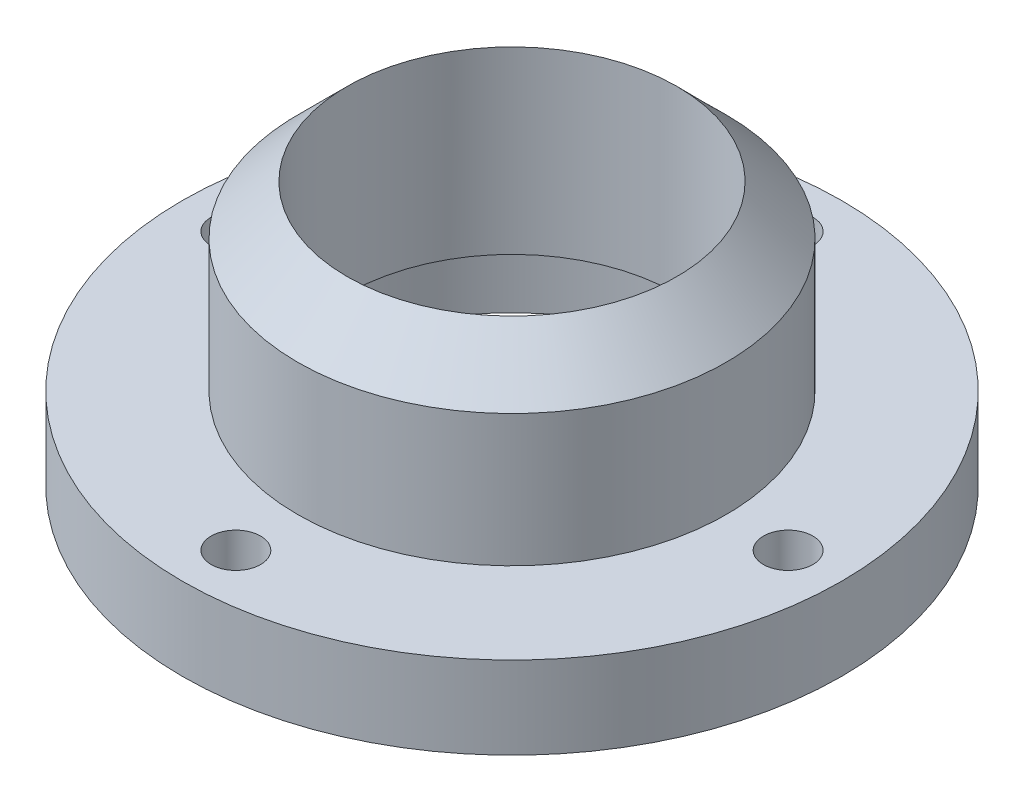
ISO-10303-21;
HEADER;
FILE_DESCRIPTION(('STEP AP214'),'2;1');
FILE_NAME('part.step','',(''),(''),'','','');
FILE_SCHEMA(('AUTOMOTIVE_DESIGN { 1 0 10303 214 1 1 1 1 }'));
ENDSEC;
DATA;
#1=APPLICATION_CONTEXT('core data for automotive mechanical design processes');
#2=APPLICATION_PROTOCOL_DEFINITION('international standard','automotive_design',2000,#1);
#3=PRODUCT_CONTEXT('',#1,'mechanical');
#4=PRODUCT('Part','Part','',(#3));
#5=PRODUCT_RELATED_PRODUCT_CATEGORY('part','',(#4));
#6=PRODUCT_DEFINITION_FORMATION('','',#4);
#7=PRODUCT_DEFINITION_CONTEXT('part definition',#1,'design');
#8=PRODUCT_DEFINITION('design','',#6,#7);
#9=PRODUCT_DEFINITION_SHAPE('','',#8);
#10=(LENGTH_UNIT() NAMED_UNIT(*) SI_UNIT(.MILLI.,.METRE.));
#11=(NAMED_UNIT(*) PLANE_ANGLE_UNIT() SI_UNIT($,.RADIAN.));
#12=(NAMED_UNIT(*) SI_UNIT($,.STERADIAN.) SOLID_ANGLE_UNIT());
#13=UNCERTAINTY_MEASURE_WITH_UNIT(LENGTH_MEASURE(1.E-05),#10,'distance_accuracy_value','');
#14=(GEOMETRIC_REPRESENTATION_CONTEXT(3) GLOBAL_UNCERTAINTY_ASSIGNED_CONTEXT((#13)) GLOBAL_UNIT_ASSIGNED_CONTEXT((#10,
#11,#12)) REPRESENTATION_CONTEXT('',''));
#15=CARTESIAN_POINT('',(0.,0.,0.));
#16=DIRECTION('',(0.,0.,1.));
#17=DIRECTION('',(1.,0.,0.));
#18=AXIS2_PLACEMENT_3D('',#15,#16,#17);
#19=CARTESIAN_POINT('',(-150.057059695434,21.5,0.));
#20=DIRECTION('',(0.,-1.,0.));
#21=DIRECTION('',(0.,0.,-1.));
#22=AXIS2_PLACEMENT_3D('',#19,#20,#21);
#23=CYLINDRICAL_SURFACE('',#22,40.);
#24=CARTESIAN_POINT('',(-150.057059695434,21.5,0.));
#25=DIRECTION('',(0.,-1.,0.));
#26=DIRECTION('',(0.,0.,1.));
#27=AXIS2_PLACEMENT_3D('',#24,#25,#26);
#28=CIRCLE('',#27,40.);
#29=CARTESIAN_POINT('',(-150.057059695434,21.5,40.));
#30=VERTEX_POINT('',#29);
#31=EDGE_CURVE('E10',#30,#30,#28,.T.);
#32=ORIENTED_EDGE('',*,*,#31,.T.);
#33=EDGE_LOOP('',(#32));
#34=FACE_BOUND('',#33,.T.);
#35=CARTESIAN_POINT('',(-150.057059695434,11.5,0.));
#36=DIRECTION('',(0.,-1.,0.));
#37=DIRECTION('',(0.,0.,1.));
#38=AXIS2_PLACEMENT_3D('',#35,#36,#37);
#39=CIRCLE('',#38,40.);
#40=CARTESIAN_POINT('',(-150.057059695434,11.5,40.));
#41=VERTEX_POINT('',#40);
#42=EDGE_CURVE('E42',#41,#41,#39,.T.);
#43=ORIENTED_EDGE('',*,*,#42,.F.);
#44=EDGE_LOOP('',(#43));
#45=FACE_BOUND('',#44,.T.);
#46=ADVANCED_FACE('F39',(#34,#45),#23,.T.);
#47=CARTESIAN_POINT('',(-150.057059695434,21.5,0.));
#48=DIRECTION('',(0.,1.,0.));
#49=DIRECTION('',(0.,0.,1.));
#50=AXIS2_PLACEMENT_3D('',#47,#48,#49);
#51=PLANE('',#50);
#52=CARTESIAN_POINT('',(-150.057059695434,21.5,0.));
#53=DIRECTION('',(0.,1.,0.));
#54=DIRECTION('',(0.,0.,1.));
#55=AXIS2_PLACEMENT_3D('',#52,#53,#54);
#56=CIRCLE('',#55,26.);
#57=CARTESIAN_POINT('',(-150.057059695434,21.5,26.));
#58=VERTEX_POINT('',#57);
#59=EDGE_CURVE('E75',#58,#58,#56,.T.);
#60=ORIENTED_EDGE('',*,*,#59,.F.);
#61=EDGE_LOOP('',(#60));
#62=FACE_BOUND('',#61,.T.);
#63=CARTESIAN_POINT('',(-183.557059695434,21.5,0.));
#64=DIRECTION('',(0.,1.,0.));
#65=DIRECTION('',(0.,0.,-1.));
#66=AXIS2_PLACEMENT_3D('',#63,#64,#65);
#67=CIRCLE('',#66,3.);
#68=CARTESIAN_POINT('',(-183.557059695434,21.5,-3.));
#69=VERTEX_POINT('',#68);
#70=EDGE_CURVE('E69',#69,#69,#67,.T.);
#71=ORIENTED_EDGE('',*,*,#70,.F.);
#72=EDGE_LOOP('',(#71));
#73=FACE_BOUND('',#72,.T.);
#74=CARTESIAN_POINT('',(-150.057059695434,21.5,33.5));
#75=DIRECTION('',(0.,-1.,0.));
#76=DIRECTION('',(0.,0.,1.));
#77=AXIS2_PLACEMENT_3D('',#74,#75,#76);
#78=CIRCLE('',#77,3.);
#79=CARTESIAN_POINT('',(-150.057059695434,21.5,36.5));
#80=VERTEX_POINT('',#79);
#81=EDGE_CURVE('E60',#80,#80,#78,.T.);
#82=ORIENTED_EDGE('',*,*,#81,.T.);
#83=EDGE_LOOP('',(#82));
#84=FACE_BOUND('',#83,.T.);
#85=CARTESIAN_POINT('',(-116.557059695434,21.5,0.));
#86=DIRECTION('',(0.,-1.,0.));
#87=DIRECTION('',(0.,0.,1.));
#88=AXIS2_PLACEMENT_3D('',#85,#86,#87);
#89=CIRCLE('',#88,3.);
#90=CARTESIAN_POINT('',(-116.557059695434,21.5,3.));
#91=VERTEX_POINT('',#90);
#92=EDGE_CURVE('E54',#91,#91,#89,.T.);
#93=ORIENTED_EDGE('',*,*,#92,.T.);
#94=EDGE_LOOP('',(#93));
#95=FACE_BOUND('',#94,.T.);
#96=CARTESIAN_POINT('',(-150.057059695434,21.5,-33.5));
#97=DIRECTION('',(0.,-1.,0.));
#98=DIRECTION('',(0.,0.,1.));
#99=AXIS2_PLACEMENT_3D('',#96,#97,#98);
#100=CIRCLE('',#99,3.);
#101=CARTESIAN_POINT('',(-150.057059695434,21.5,-30.5));
#102=VERTEX_POINT('',#101);
#103=EDGE_CURVE('E49',#102,#102,#100,.T.);
#104=ORIENTED_EDGE('',*,*,#103,.T.);
#105=EDGE_LOOP('',(#104));
#106=FACE_BOUND('',#105,.T.);
#107=ORIENTED_EDGE('',*,*,#31,.F.);
#108=EDGE_LOOP('',(#107));
#109=FACE_BOUND('',#108,.T.);
#110=ADVANCED_FACE('F113',(#62,#73,#84,#95,#106,#109),#51,.T.);
#111=CARTESIAN_POINT('',(-150.057059695434,11.5,0.));
#112=DIRECTION('',(0.,1.,0.));
#113=DIRECTION('',(0.,0.,1.));
#114=AXIS2_PLACEMENT_3D('',#111,#112,#113);
#115=PLANE('',#114);
#116=CARTESIAN_POINT('',(-150.057059695434,11.5,0.));
#117=DIRECTION('',(0.,-1.,0.));
#118=DIRECTION('',(0.,0.,1.));
#119=AXIS2_PLACEMENT_3D('',#116,#117,#118);
#120=CIRCLE('',#119,25.75);
#121=CARTESIAN_POINT('',(-150.057059695434,11.5,25.75));
#122=VERTEX_POINT('',#121);
#123=EDGE_CURVE('E81',#122,#122,#120,.T.);
#124=ORIENTED_EDGE('',*,*,#123,.F.);
#125=EDGE_LOOP('',(#124));
#126=FACE_BOUND('',#125,.T.);
#127=CARTESIAN_POINT('',(-183.557059695434,11.5,0.));
#128=DIRECTION('',(0.,1.,0.));
#129=DIRECTION('',(0.,0.,-1.));
#130=AXIS2_PLACEMENT_3D('',#127,#128,#129);
#131=CIRCLE('',#130,3.);
#132=CARTESIAN_POINT('',(-183.557059695434,11.5,-3.));
#133=VERTEX_POINT('',#132);
#134=EDGE_CURVE('E66',#133,#133,#131,.T.);
#135=ORIENTED_EDGE('',*,*,#134,.T.);
#136=EDGE_LOOP('',(#135));
#137=FACE_BOUND('',#136,.T.);
#138=CARTESIAN_POINT('',(-150.057059695434,11.5,33.5));
#139=DIRECTION('',(0.,-1.,0.));
#140=DIRECTION('',(0.,0.,1.));
#141=AXIS2_PLACEMENT_3D('',#138,#139,#140);
#142=CIRCLE('',#141,3.);
#143=CARTESIAN_POINT('',(-150.057059695434,11.5,36.5));
#144=VERTEX_POINT('',#143);
#145=EDGE_CURVE('E63',#144,#144,#142,.T.);
#146=ORIENTED_EDGE('',*,*,#145,.F.);
#147=EDGE_LOOP('',(#146));
#148=FACE_BOUND('',#147,.T.);
#149=CARTESIAN_POINT('',(-116.557059695434,11.5,0.));
#150=DIRECTION('',(0.,-1.,0.));
#151=DIRECTION('',(0.,0.,1.));
#152=AXIS2_PLACEMENT_3D('',#149,#150,#151);
#153=CIRCLE('',#152,3.);
#154=CARTESIAN_POINT('',(-116.557059695434,11.5,3.));
#155=VERTEX_POINT('',#154);
#156=EDGE_CURVE('E57',#155,#155,#153,.T.);
#157=ORIENTED_EDGE('',*,*,#156,.F.);
#158=EDGE_LOOP('',(#157));
#159=FACE_BOUND('',#158,.T.);
#160=CARTESIAN_POINT('',(-150.057059695434,11.5,-33.5));
#161=DIRECTION('',(0.,-1.,0.));
#162=DIRECTION('',(0.,0.,1.));
#163=AXIS2_PLACEMENT_3D('',#160,#161,#162);
#164=CIRCLE('',#163,3.);
#165=CARTESIAN_POINT('',(-150.057059695434,11.5,-30.5));
#166=VERTEX_POINT('',#165);
#167=EDGE_CURVE('E51',#166,#166,#164,.T.);
#168=ORIENTED_EDGE('',*,*,#167,.F.);
#169=EDGE_LOOP('',(#168));
#170=FACE_BOUND('',#169,.T.);
#171=ORIENTED_EDGE('',*,*,#42,.T.);
#172=EDGE_LOOP('',(#171));
#173=FACE_BOUND('',#172,.T.);
#174=ADVANCED_FACE('F109',(#126,#137,#148,#159,#170,#173),#115,.F.);
#175=CARTESIAN_POINT('',(-150.057059695434,21.5,-33.5));
#176=DIRECTION('',(0.,-1.,0.));
#177=DIRECTION('',(0.,0.,-1.));
#178=AXIS2_PLACEMENT_3D('',#175,#176,#177);
#179=CYLINDRICAL_SURFACE('',#178,3.);
#180=ORIENTED_EDGE('',*,*,#103,.F.);
#181=EDGE_LOOP('',(#180));
#182=FACE_BOUND('',#181,.T.);
#183=ORIENTED_EDGE('',*,*,#167,.T.);
#184=EDGE_LOOP('',(#183));
#185=FACE_BOUND('',#184,.T.);
#186=ADVANCED_FACE('F112',(#182,#185),#179,.F.);
#187=CARTESIAN_POINT('',(-116.557059695434,21.5,0.));
#188=DIRECTION('',(0.,-1.,0.));
#189=DIRECTION('',(0.,0.,-1.));
#190=AXIS2_PLACEMENT_3D('',#187,#188,#189);
#191=CYLINDRICAL_SURFACE('',#190,3.);
#192=ORIENTED_EDGE('',*,*,#92,.F.);
#193=EDGE_LOOP('',(#192));
#194=FACE_BOUND('',#193,.T.);
#195=ORIENTED_EDGE('',*,*,#156,.T.);
#196=EDGE_LOOP('',(#195));
#197=FACE_BOUND('',#196,.T.);
#198=ADVANCED_FACE('F139',(#194,#197),#191,.F.);
#199=CARTESIAN_POINT('',(-150.057059695434,21.5,33.5));
#200=DIRECTION('',(0.,-1.,0.));
#201=DIRECTION('',(0.,0.,-1.));
#202=AXIS2_PLACEMENT_3D('',#199,#200,#201);
#203=CYLINDRICAL_SURFACE('',#202,3.);
#204=ORIENTED_EDGE('',*,*,#81,.F.);
#205=EDGE_LOOP('',(#204));
#206=FACE_BOUND('',#205,.T.);
#207=ORIENTED_EDGE('',*,*,#145,.T.);
#208=EDGE_LOOP('',(#207));
#209=FACE_BOUND('',#208,.T.);
#210=ADVANCED_FACE('F143',(#206,#209),#203,.F.);
#211=CARTESIAN_POINT('',(-183.557059695434,11.5,0.));
#212=DIRECTION('',(0.,1.,0.));
#213=DIRECTION('',(0.,0.,1.));
#214=AXIS2_PLACEMENT_3D('',#211,#212,#213);
#215=CYLINDRICAL_SURFACE('',#214,3.);
#216=ORIENTED_EDGE('',*,*,#134,.F.);
#217=EDGE_LOOP('',(#216));
#218=FACE_BOUND('',#217,.T.);
#219=ORIENTED_EDGE('',*,*,#70,.T.);
#220=EDGE_LOOP('',(#219));
#221=FACE_BOUND('',#220,.T.);
#222=ADVANCED_FACE('F147',(#218,#221),#215,.F.);
#223=CARTESIAN_POINT('',(-150.057059695434,37.5,0.));
#224=DIRECTION('',(0.,-1.,0.));
#225=DIRECTION('',(0.,0.,-1.));
#226=AXIS2_PLACEMENT_3D('',#223,#224,#225);
#227=CYLINDRICAL_SURFACE('',#226,26.);
#228=CARTESIAN_POINT('',(-150.057059695434,37.5,0.));
#229=DIRECTION('',(0.,1.,0.));
#230=DIRECTION('',(0.,0.,1.));
#231=AXIS2_PLACEMENT_3D('',#228,#229,#230);
#232=CIRCLE('',#231,26.);
#233=CARTESIAN_POINT('',(-150.057059695434,37.5,26.));
#234=VERTEX_POINT('',#233);
#235=EDGE_CURVE('E72',#234,#234,#232,.T.);
#236=ORIENTED_EDGE('',*,*,#235,.F.);
#237=EDGE_LOOP('',(#236));
#238=FACE_BOUND('',#237,.T.);
#239=ORIENTED_EDGE('',*,*,#59,.T.);
#240=EDGE_LOOP('',(#239));
#241=FACE_BOUND('',#240,.T.);
#242=ADVANCED_FACE('F150',(#238,#241),#227,.T.);
#243=CARTESIAN_POINT('',(-150.057059695434,37.5,0.));
#244=DIRECTION('',(0.,-1.,0.));
#245=DIRECTION('',(0.,0.,1.));
#246=AXIS2_PLACEMENT_3D('',#243,#244,#245);
#247=CONICAL_SURFACE('',#246,26.,0.785398163397447);
#248=CARTESIAN_POINT('',(-150.057059695434,43.5,0.));
#249=DIRECTION('',(0.,-1.,0.));
#250=DIRECTION('',(0.,0.,-1.));
#251=AXIS2_PLACEMENT_3D('',#248,#249,#250);
#252=CIRCLE('',#251,20.);
#253=CARTESIAN_POINT('',(-150.057059695434,43.5,-20.));
#254=VERTEX_POINT('',#253);
#255=EDGE_CURVE('E84',#254,#254,#252,.T.);
#256=ORIENTED_EDGE('',*,*,#255,.T.);
#257=EDGE_LOOP('',(#256));
#258=FACE_BOUND('',#257,.T.);
#259=ORIENTED_EDGE('',*,*,#235,.T.);
#260=EDGE_LOOP('',(#259));
#261=FACE_BOUND('',#260,.T.);
#262=ADVANCED_FACE('F105',(#258,#261),#247,.T.);
#263=CARTESIAN_POINT('',(-150.057059695434,21.7,0.));
#264=DIRECTION('',(0.,-1.,0.));
#265=DIRECTION('',(0.,0.,-1.));
#266=AXIS2_PLACEMENT_3D('',#263,#264,#265);
#267=CYLINDRICAL_SURFACE('',#266,25.75);
#268=CARTESIAN_POINT('',(-150.057059695434,21.7,0.));
#269=DIRECTION('',(0.,-1.,0.));
#270=DIRECTION('',(0.,0.,1.));
#271=AXIS2_PLACEMENT_3D('',#268,#269,#270);
#272=CIRCLE('',#271,25.75);
#273=CARTESIAN_POINT('',(-150.057059695434,21.7,25.75));
#274=VERTEX_POINT('',#273);
#275=EDGE_CURVE('E78',#274,#274,#272,.T.);
#276=ORIENTED_EDGE('',*,*,#275,.F.);
#277=EDGE_LOOP('',(#276));
#278=FACE_BOUND('',#277,.T.);
#279=ORIENTED_EDGE('',*,*,#123,.T.);
#280=EDGE_LOOP('',(#279));
#281=FACE_BOUND('',#280,.T.);
#282=ADVANCED_FACE('F99',(#278,#281),#267,.F.);
#283=CARTESIAN_POINT('',(-150.057059695434,21.7,0.));
#284=DIRECTION('',(0.,1.,0.));
#285=DIRECTION('',(0.,0.,1.));
#286=AXIS2_PLACEMENT_3D('',#283,#284,#285);
#287=PLANE('',#286);
#288=CARTESIAN_POINT('',(-150.057059695434,21.7,0.));
#289=DIRECTION('',(0.,-1.,0.));
#290=DIRECTION('',(0.,0.,1.));
#291=AXIS2_PLACEMENT_3D('',#288,#289,#290);
#292=CIRCLE('',#291,20.);
#293=CARTESIAN_POINT('',(-150.057059695434,21.7,-20.));
#294=VERTEX_POINT('',#293);
#295=EDGE_CURVE('E89',#294,#294,#292,.T.);
#296=ORIENTED_EDGE('',*,*,#295,.F.);
#297=EDGE_LOOP('',(#296));
#298=FACE_BOUND('',#297,.T.);
#299=ORIENTED_EDGE('',*,*,#275,.T.);
#300=EDGE_LOOP('',(#299));
#301=FACE_BOUND('',#300,.T.);
#302=ADVANCED_FACE('F96',(#298,#301),#287,.F.);
#303=CARTESIAN_POINT('',(-150.057059695434,57.5,0.));
#304=DIRECTION('',(0.,-1.,0.));
#305=DIRECTION('',(0.,0.,-1.));
#306=AXIS2_PLACEMENT_3D('',#303,#304,#305);
#307=CYLINDRICAL_SURFACE('',#306,20.);
#308=CARTESIAN_POINT('',(-150.057059695434,21.7,-20.));
#309=CARTESIAN_POINT('',(-150.057059695434,21.9270833333333,-20.));
#310=CARTESIAN_POINT('',(-150.057059695434,22.1541666666667,-20.));
#311=CARTESIAN_POINT('',(-150.057059695434,22.6083333333333,-20.));
#312=CARTESIAN_POINT('',(-150.057059695434,22.8354166666667,-20.));
#313=CARTESIAN_POINT('',(-150.057059695434,23.2895833333333,-20.));
#314=CARTESIAN_POINT('',(-150.057059695434,23.5166666666667,-20.));
#315=CARTESIAN_POINT('',(-150.057059695434,23.9708333333333,-20.));
#316=CARTESIAN_POINT('',(-150.057059695434,24.1979166666667,-20.));
#317=CARTESIAN_POINT('',(-150.057059695434,24.6520833333333,-20.));
#318=CARTESIAN_POINT('',(-150.057059695434,24.8791666666667,-20.));
#319=CARTESIAN_POINT('',(-150.057059695434,25.3333333333333,-20.));
#320=CARTESIAN_POINT('',(-150.057059695434,25.5604166666667,-20.));
#321=CARTESIAN_POINT('',(-150.057059695434,26.0145833333333,-20.));
#322=CARTESIAN_POINT('',(-150.057059695434,26.2416666666667,-20.));
#323=CARTESIAN_POINT('',(-150.057059695434,26.6958333333333,-20.));
#324=CARTESIAN_POINT('',(-150.057059695434,26.9229166666667,-20.));
#325=CARTESIAN_POINT('',(-150.057059695434,27.3770833333333,-20.));
#326=CARTESIAN_POINT('',(-150.057059695434,27.6041666666667,-20.));
#327=CARTESIAN_POINT('',(-150.057059695434,28.0583333333333,-20.));
#328=CARTESIAN_POINT('',(-150.057059695434,28.2854166666667,-20.));
#329=CARTESIAN_POINT('',(-150.057059695434,28.7395833333333,-20.));
#330=CARTESIAN_POINT('',(-150.057059695434,28.9666666666667,-20.));
#331=CARTESIAN_POINT('',(-150.057059695434,29.4208333333333,-20.));
#332=CARTESIAN_POINT('',(-150.057059695434,29.6479166666667,-20.));
#333=CARTESIAN_POINT('',(-150.057059695434,30.1020833333333,-20.));
#334=CARTESIAN_POINT('',(-150.057059695434,30.3291666666667,-20.));
#335=CARTESIAN_POINT('',(-150.057059695434,30.7833333333333,-20.));
#336=CARTESIAN_POINT('',(-150.057059695434,31.0104166666667,-20.));
#337=CARTESIAN_POINT('',(-150.057059695434,31.4645833333334,-20.));
#338=CARTESIAN_POINT('',(-150.057059695434,31.6916666666667,-20.));
#339=CARTESIAN_POINT('',(-150.057059695434,32.1458333333333,-20.));
#340=CARTESIAN_POINT('',(-150.057059695434,32.3729166666667,-20.));
#341=CARTESIAN_POINT('',(-150.057059695434,32.8270833333334,-20.));
#342=CARTESIAN_POINT('',(-150.057059695434,33.0541666666667,-20.));
#343=CARTESIAN_POINT('',(-150.057059695434,33.5083333333334,-20.));
#344=CARTESIAN_POINT('',(-150.057059695434,33.7354166666667,-20.));
#345=CARTESIAN_POINT('',(-150.057059695434,34.1895833333334,-20.));
#346=CARTESIAN_POINT('',(-150.057059695434,34.4166666666667,-20.));
#347=CARTESIAN_POINT('',(-150.057059695434,34.8708333333334,-20.));
#348=CARTESIAN_POINT('',(-150.057059695434,35.0979166666667,-20.));
#349=CARTESIAN_POINT('',(-150.057059695434,35.5520833333334,-20.));
#350=CARTESIAN_POINT('',(-150.057059695434,35.7791666666667,-20.));
#351=CARTESIAN_POINT('',(-150.057059695434,36.2333333333334,-20.));
#352=CARTESIAN_POINT('',(-150.057059695434,36.4604166666667,-20.));
#353=CARTESIAN_POINT('',(-150.057059695434,36.9145833333334,-20.));
#354=CARTESIAN_POINT('',(-150.057059695434,37.1416666666667,-20.));
#355=CARTESIAN_POINT('',(-150.057059695434,37.5958333333334,-20.));
#356=CARTESIAN_POINT('',(-150.057059695434,37.8229166666667,-20.));
#357=CARTESIAN_POINT('',(-150.057059695434,38.2770833333334,-20.));
#358=CARTESIAN_POINT('',(-150.057059695434,38.5041666666667,-20.));
#359=CARTESIAN_POINT('',(-150.057059695434,38.9583333333334,-20.));
#360=CARTESIAN_POINT('',(-150.057059695434,39.1854166666667,-20.));
#361=CARTESIAN_POINT('',(-150.057059695434,39.6395833333334,-20.));
#362=CARTESIAN_POINT('',(-150.057059695434,39.8666666666667,-20.));
#363=CARTESIAN_POINT('',(-150.057059695434,40.3208333333334,-20.));
#364=CARTESIAN_POINT('',(-150.057059695434,40.5479166666667,-20.));
#365=CARTESIAN_POINT('',(-150.057059695434,41.0020833333334,-20.));
#366=CARTESIAN_POINT('',(-150.057059695434,41.2291666666667,-20.));
#367=CARTESIAN_POINT('',(-150.057059695434,41.6833333333334,-20.));
#368=CARTESIAN_POINT('',(-150.057059695434,41.9104166666667,-20.));
#369=CARTESIAN_POINT('',(-150.057059695434,42.3645833333334,-20.));
#370=CARTESIAN_POINT('',(-150.057059695434,42.5916666666667,-20.));
#371=CARTESIAN_POINT('',(-150.057059695434,43.0458333333334,-20.));
#372=CARTESIAN_POINT('',(-150.057059695434,43.2729166666667,-20.));
#373=CARTESIAN_POINT('',(-150.057059695434,43.5,-20.));
#374=B_SPLINE_CURVE_WITH_KNOTS('',3,(#308,#309,#310,#311,#312,#313,#314,#315,#316,#317,#318,
#319,#320,#321,#322,#323,#324,#325,#326,#327,#328,#329,#330,#331,#332,#333,#334,#335,#336,#337,
#338,#339,#340,#341,#342,#343,#344,#345,#346,#347,#348,#349,#350,#351,#352,#353,#354,#355,#356,
#357,#358,#359,#360,#361,#362,#363,#364,#365,#366,#367,#368,#369,#370,#371,#372,#373),
.UNSPECIFIED.,.F.,.F.,(4,2,2,2,2,2,2,2,2,2,2,2,2,2,2,2,2,2,2,2,2,2,2,2,2,2,2,2,2,2,2,2,4),(0.,
0.681250000000001,1.3625,2.04375,2.725,3.40625000000001,4.08750000000001,4.76875000000001,
5.45000000000001,6.13125000000001,6.81250000000001,7.49375000000001,8.17500000000001,
8.85625000000001,9.53750000000001,10.21875,10.9,11.58125,12.2625,12.94375,13.625,14.30625,
14.9875,15.66875,16.35,17.03125,17.7125,18.39375,19.075,19.75625,20.4375,21.11875,21.8),.UNSPECIFIED.);
#375=EDGE_CURVE('BSEAM93',#294,#254,#374,.T.);
#376=ORIENTED_EDGE('',*,*,#295,.T.);
#377=ORIENTED_EDGE('',*,*,#255,.F.);
#378=ORIENTED_EDGE('',*,*,#375,.T.);
#379=ORIENTED_EDGE('',*,*,#375,.F.);
#380=EDGE_LOOP('',(#376,#378,#377,#379));
#381=FACE_BOUND('',#380,.T.);
#382=ADVANCED_FACE('F93',(#381),#307,.F.);
#383=CLOSED_SHELL('',(#46,#110,#174,#186,#198,#210,#222,#242,#262,#282,#302,#382));
#384=MANIFOLD_SOLID_BREP('B2',#383);
#385=ADVANCED_BREP_SHAPE_REPRESENTATION('',(#18,#384),#14);
#386=SHAPE_DEFINITION_REPRESENTATION(#9,#385);
ENDSEC;
END-ISO-10303-21;
